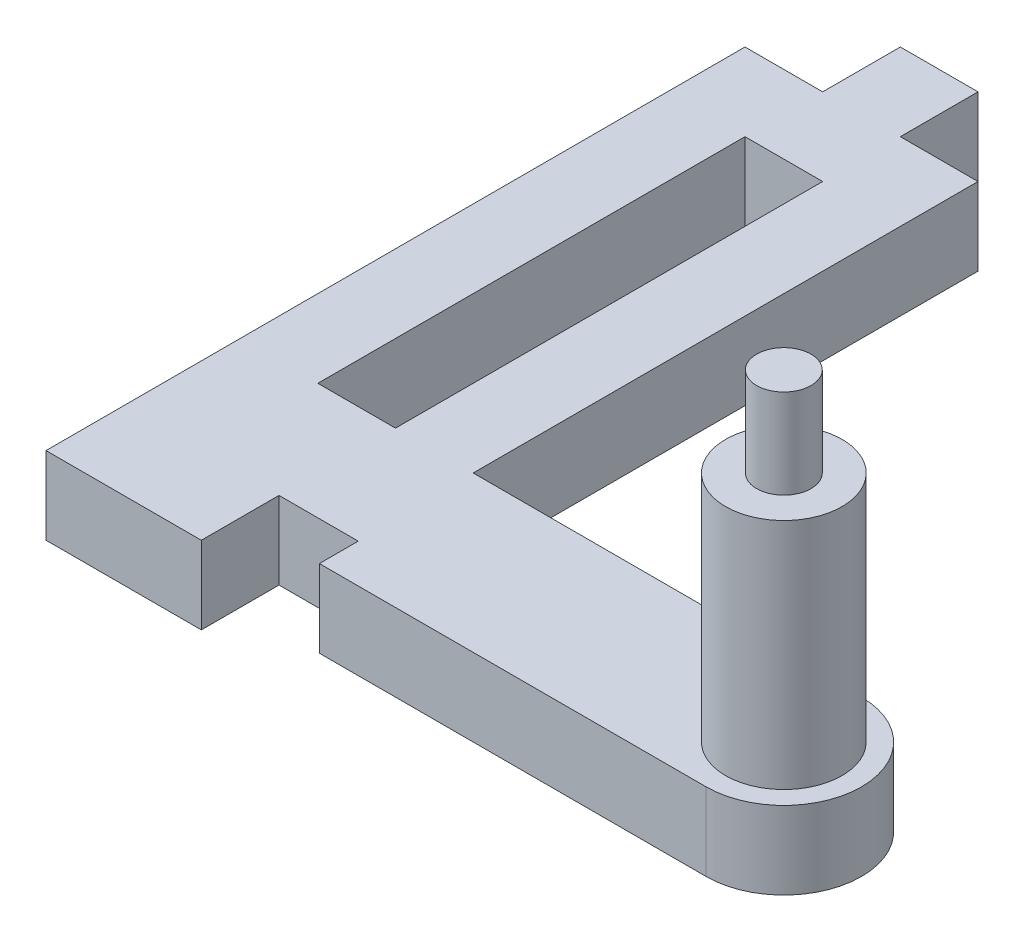
ISO-10303-21;
HEADER;
FILE_DESCRIPTION(('STEP AP214'),'2;1');
FILE_NAME('part.step','',(''),(''),'','','');
FILE_SCHEMA(('AUTOMOTIVE_DESIGN { 1 0 10303 214 1 1 1 1 }'));
ENDSEC;
DATA;
#1=APPLICATION_CONTEXT('core data for automotive mechanical design processes');
#2=APPLICATION_PROTOCOL_DEFINITION('international standard','automotive_design',2000,#1);
#3=PRODUCT_CONTEXT('',#1,'mechanical');
#4=PRODUCT('Part','Part','',(#3));
#5=PRODUCT_RELATED_PRODUCT_CATEGORY('part','',(#4));
#6=PRODUCT_DEFINITION_FORMATION('','',#4);
#7=PRODUCT_DEFINITION_CONTEXT('part definition',#1,'design');
#8=PRODUCT_DEFINITION('design','',#6,#7);
#9=PRODUCT_DEFINITION_SHAPE('','',#8);
#10=(LENGTH_UNIT() NAMED_UNIT(*) SI_UNIT(.MILLI.,.METRE.));
#11=(NAMED_UNIT(*) PLANE_ANGLE_UNIT() SI_UNIT($,.RADIAN.));
#12=(NAMED_UNIT(*) SI_UNIT($,.STERADIAN.) SOLID_ANGLE_UNIT());
#13=UNCERTAINTY_MEASURE_WITH_UNIT(LENGTH_MEASURE(1.E-05),#10,'distance_accuracy_value','');
#14=(GEOMETRIC_REPRESENTATION_CONTEXT(3) GLOBAL_UNCERTAINTY_ASSIGNED_CONTEXT((#13)) GLOBAL_UNIT_ASSIGNED_CONTEXT((#10,
#11,#12)) REPRESENTATION_CONTEXT('',''));
#15=CARTESIAN_POINT('',(0.,0.,0.));
#16=DIRECTION('',(0.,0.,1.));
#17=DIRECTION('',(1.,0.,0.));
#18=AXIS2_PLACEMENT_3D('',#15,#16,#17);
#19=CARTESIAN_POINT('',(0.,5.,0.));
#20=DIRECTION('',(0.,0.,-1.));
#21=DIRECTION('',(-1.,0.,0.));
#22=AXIS2_PLACEMENT_3D('',#19,#20,#21);
#23=PLANE('',#22);
#24=DIRECTION('',(1.,0.,0.));
#25=VECTOR('',#24,1.);
#26=CARTESIAN_POINT('',(0.,0.,0.));
#27=LINE('',#26,#25);
#28=CARTESIAN_POINT('',(10.,0.,0.));
#29=VERTEX_POINT('',#28);
#30=CARTESIAN_POINT('',(15.1,0.,0.));
#31=VERTEX_POINT('',#30);
#32=EDGE_CURVE('E475',#29,#31,#27,.T.);
#33=ORIENTED_EDGE('',*,*,#32,.T.);
#34=DIRECTION('',(0.,-1.,0.));
#35=VECTOR('',#34,1.);
#36=CARTESIAN_POINT('',(15.1,5.,0.));
#37=LINE('',#36,#35);
#38=CARTESIAN_POINT('',(15.1,5.,0.));
#39=VERTEX_POINT('',#38);
#40=EDGE_CURVE('E499',#39,#31,#37,.T.);
#41=ORIENTED_EDGE('',*,*,#40,.F.);
#42=DIRECTION('',(1.,0.,0.));
#43=VECTOR('',#42,1.);
#44=CARTESIAN_POINT('',(0.,5.,0.));
#45=LINE('',#44,#43);
#46=CARTESIAN_POINT('',(10.,5.,0.));
#47=VERTEX_POINT('',#46);
#48=EDGE_CURVE('E449',#47,#39,#45,.T.);
#49=ORIENTED_EDGE('',*,*,#48,.F.);
#50=DIRECTION('',(0.,-1.,0.));
#51=VECTOR('',#50,1.);
#52=CARTESIAN_POINT('',(10.,5.,0.));
#53=LINE('',#52,#51);
#54=EDGE_CURVE('E503',#47,#29,#53,.T.);
#55=ORIENTED_EDGE('',*,*,#54,.T.);
#56=EDGE_LOOP('',(#33,#41,#49,#55));
#57=FACE_BOUND('',#56,.T.);
#58=ADVANCED_FACE('F161',(#57),#23,.F.);
#59=CARTESIAN_POINT('',(0.,5.,-7.5));
#60=DIRECTION('',(0.,0.,-1.));
#61=DIRECTION('',(-1.,0.,0.));
#62=AXIS2_PLACEMENT_3D('',#59,#60,#61);
#63=PLANE('',#62);
#64=DIRECTION('',(1.,0.,0.));
#65=VECTOR('',#64,1.);
#66=CARTESIAN_POINT('',(0.,0.,-7.5));
#67=LINE('',#66,#65);
#68=CARTESIAN_POINT('',(15.,0.,-7.5));
#69=VERTEX_POINT('',#68);
#70=CARTESIAN_POINT('',(40.,0.,-7.5));
#71=VERTEX_POINT('',#70);
#72=EDGE_CURVE('E279',#69,#71,#67,.T.);
#73=ORIENTED_EDGE('',*,*,#72,.F.);
#74=DIRECTION('',(0.,1.,0.));
#75=VECTOR('',#74,1.);
#76=CARTESIAN_POINT('',(15.,5.,-7.5));
#77=LINE('',#76,#75);
#78=CARTESIAN_POINT('',(15.,5.,-7.5));
#79=VERTEX_POINT('',#78);
#80=EDGE_CURVE('E180',#69,#79,#77,.T.);
#81=ORIENTED_EDGE('',*,*,#80,.T.);
#82=DIRECTION('',(1.,0.,0.));
#83=VECTOR('',#82,1.);
#84=CARTESIAN_POINT('',(0.,5.,-7.5));
#85=LINE('',#84,#83);
#86=CARTESIAN_POINT('',(40.,5.,-7.5));
#87=VERTEX_POINT('',#86);
#88=EDGE_CURVE('E443',#79,#87,#85,.T.);
#89=ORIENTED_EDGE('',*,*,#88,.T.);
#90=DIRECTION('',(0.,-1.,0.));
#91=VECTOR('',#90,1.);
#92=CARTESIAN_POINT('',(40.,5.,-7.5));
#93=LINE('',#92,#91);
#94=EDGE_CURVE('E462',#87,#71,#93,.T.);
#95=ORIENTED_EDGE('',*,*,#94,.T.);
#96=EDGE_LOOP('',(#73,#81,#89,#95));
#97=FACE_BOUND('',#96,.T.);
#98=ADVANCED_FACE('F528',(#97),#63,.T.);
#99=CARTESIAN_POINT('',(0.,5.,0.));
#100=DIRECTION('',(-1.,0.,0.));
#101=DIRECTION('',(0.,0.,1.));
#102=AXIS2_PLACEMENT_3D('',#99,#100,#101);
#103=PLANE('',#102);
#104=DIRECTION('',(0.,-1.,0.));
#105=VECTOR('',#104,1.);
#106=CARTESIAN_POINT('',(0.,5.,-40.));
#107=LINE('',#106,#105);
#108=CARTESIAN_POINT('',(0.,5.,-40.));
#109=VERTEX_POINT('',#108);
#110=CARTESIAN_POINT('',(0.,0.,-40.));
#111=VERTEX_POINT('',#110);
#112=EDGE_CURVE('E343',#109,#111,#107,.T.);
#113=ORIENTED_EDGE('',*,*,#112,.T.);
#114=DIRECTION('',(0.,0.,-1.));
#115=VECTOR('',#114,1.);
#116=CARTESIAN_POINT('',(0.,0.,0.));
#117=LINE('',#116,#115);
#118=CARTESIAN_POINT('',(0.,0.,5.));
#119=VERTEX_POINT('',#118);
#120=EDGE_CURVE('E426',#119,#111,#117,.T.);
#121=ORIENTED_EDGE('',*,*,#120,.F.);
#122=DIRECTION('',(0.,-1.,0.));
#123=VECTOR('',#122,1.);
#124=CARTESIAN_POINT('',(0.,5.,5.));
#125=LINE('',#124,#123);
#126=CARTESIAN_POINT('',(0.,5.,5.));
#127=VERTEX_POINT('',#126);
#128=EDGE_CURVE('E297',#127,#119,#125,.T.);
#129=ORIENTED_EDGE('',*,*,#128,.F.);
#130=DIRECTION('',(0.,0.,-1.));
#131=VECTOR('',#130,1.);
#132=CARTESIAN_POINT('',(0.,5.,0.));
#133=LINE('',#132,#131);
#134=EDGE_CURVE('E424',#127,#109,#133,.T.);
#135=ORIENTED_EDGE('',*,*,#134,.T.);
#136=EDGE_LOOP('',(#113,#121,#129,#135));
#137=FACE_BOUND('',#136,.T.);
#138=ADVANCED_FACE('F422',(#137),#103,.T.);
#139=CARTESIAN_POINT('',(15.1,5.,0.));
#140=DIRECTION('',(1.,0.,0.));
#141=DIRECTION('',(0.,0.,-1.));
#142=AXIS2_PLACEMENT_3D('',#139,#140,#141);
#143=PLANE('',#142);
#144=DIRECTION('',(0.,0.,1.));
#145=VECTOR('',#144,1.);
#146=CARTESIAN_POINT('',(15.1,0.,0.));
#147=LINE('',#146,#145);
#148=CARTESIAN_POINT('',(15.1,0.,2.5));
#149=VERTEX_POINT('',#148);
#150=EDGE_CURVE('E478',#31,#149,#147,.T.);
#151=ORIENTED_EDGE('',*,*,#150,.T.);
#152=DIRECTION('',(0.,-1.,0.));
#153=VECTOR('',#152,1.);
#154=CARTESIAN_POINT('',(15.1,5.,2.5));
#155=LINE('',#154,#153);
#156=CARTESIAN_POINT('',(15.1,5.,2.5));
#157=VERTEX_POINT('',#156);
#158=EDGE_CURVE('E495',#157,#149,#155,.T.);
#159=ORIENTED_EDGE('',*,*,#158,.F.);
#160=DIRECTION('',(0.,0.,1.));
#161=VECTOR('',#160,1.);
#162=CARTESIAN_POINT('',(15.1,5.,0.));
#163=LINE('',#162,#161);
#164=EDGE_CURVE('E452',#39,#157,#163,.T.);
#165=ORIENTED_EDGE('',*,*,#164,.F.);
#166=ORIENTED_EDGE('',*,*,#40,.T.);
#167=EDGE_LOOP('',(#151,#159,#165,#166));
#168=FACE_BOUND('',#167,.T.);
#169=ADVANCED_FACE('F517',(#168),#143,.F.);
#170=CARTESIAN_POINT('',(0.,5.,2.5));
#171=DIRECTION('',(0.,0.,-1.));
#172=DIRECTION('',(-1.,0.,0.));
#173=AXIS2_PLACEMENT_3D('',#170,#171,#172);
#174=PLANE('',#173);
#175=DIRECTION('',(1.,0.,0.));
#176=VECTOR('',#175,1.);
#177=CARTESIAN_POINT('',(0.,0.,2.5));
#178=LINE('',#177,#176);
#179=CARTESIAN_POINT('',(40.,0.,2.5));
#180=VERTEX_POINT('',#179);
#181=EDGE_CURVE('E481',#149,#180,#178,.T.);
#182=ORIENTED_EDGE('',*,*,#181,.T.);
#183=DIRECTION('',(0.,-1.,0.));
#184=VECTOR('',#183,1.);
#185=CARTESIAN_POINT('',(40.,5.,2.5));
#186=LINE('',#185,#184);
#187=CARTESIAN_POINT('',(40.,5.,2.5));
#188=VERTEX_POINT('',#187);
#189=EDGE_CURVE('E491',#188,#180,#186,.T.);
#190=ORIENTED_EDGE('',*,*,#189,.F.);
#191=DIRECTION('',(1.,0.,0.));
#192=VECTOR('',#191,1.);
#193=CARTESIAN_POINT('',(0.,5.,2.5));
#194=LINE('',#193,#192);
#195=EDGE_CURVE('E455',#157,#188,#194,.T.);
#196=ORIENTED_EDGE('',*,*,#195,.F.);
#197=ORIENTED_EDGE('',*,*,#158,.T.);
#198=EDGE_LOOP('',(#182,#190,#196,#197));
#199=FACE_BOUND('',#198,.T.);
#200=ADVANCED_FACE('F524',(#199),#174,.F.);
#201=CARTESIAN_POINT('',(40.,5.,-2.5));
#202=DIRECTION('',(0.,-1.,0.));
#203=DIRECTION('',(0.,0.,-1.));
#204=AXIS2_PLACEMENT_3D('',#201,#202,#203);
#205=CYLINDRICAL_SURFACE('',#204,5.);
#206=CARTESIAN_POINT('',(40.,0.,-2.5));
#207=DIRECTION('',(0.,1.,0.));
#208=DIRECTION('',(0.,0.,1.));
#209=AXIS2_PLACEMENT_3D('',#206,#207,#208);
#210=CIRCLE('',#209,5.);
#211=EDGE_CURVE('E484',#180,#71,#210,.T.);
#212=ORIENTED_EDGE('',*,*,#211,.T.);
#213=ORIENTED_EDGE('',*,*,#94,.F.);
#214=CARTESIAN_POINT('',(40.,5.,-2.5));
#215=DIRECTION('',(0.,1.,0.));
#216=DIRECTION('',(0.,0.,1.));
#217=AXIS2_PLACEMENT_3D('',#214,#215,#216);
#218=CIRCLE('',#217,5.);
#219=EDGE_CURVE('E458',#188,#87,#218,.T.);
#220=ORIENTED_EDGE('',*,*,#219,.F.);
#221=ORIENTED_EDGE('',*,*,#189,.T.);
#222=EDGE_LOOP('',(#212,#213,#220,#221));
#223=FACE_BOUND('',#222,.T.);
#224=ADVANCED_FACE('F527',(#223),#205,.T.);
#225=DIRECTION('',(0.,-1.,0.));
#226=VECTOR('',#225,1.);
#227=CARTESIAN_POINT('',(5.,5.,-7.5));
#228=LINE('',#227,#226);
#229=CARTESIAN_POINT('',(5.,5.,-7.5));
#230=VERTEX_POINT('',#229);
#231=CARTESIAN_POINT('',(5.,0.,-7.5));
#232=VERTEX_POINT('',#231);
#233=EDGE_CURVE('E165',#230,#232,#228,.T.);
#234=ORIENTED_EDGE('',*,*,#233,.F.);
#235=CARTESIAN_POINT('',(10.,5.,-7.5));
#236=VERTEX_POINT('',#235);
#237=EDGE_CURVE('E440',#230,#236,#85,.T.);
#238=ORIENTED_EDGE('',*,*,#237,.T.);
#239=DIRECTION('',(0.,-1.,0.));
#240=VECTOR('',#239,1.);
#241=CARTESIAN_POINT('',(10.,5.,-7.5));
#242=LINE('',#241,#240);
#243=CARTESIAN_POINT('',(10.,0.,-7.5));
#244=VERTEX_POINT('',#243);
#245=EDGE_CURVE('E286',#236,#244,#242,.T.);
#246=ORIENTED_EDGE('',*,*,#245,.T.);
#247=EDGE_CURVE('E465',#232,#244,#67,.T.);
#248=ORIENTED_EDGE('',*,*,#247,.F.);
#249=EDGE_LOOP('',(#234,#238,#246,#248));
#250=FACE_BOUND('',#249,.T.);
#251=ADVANCED_FACE('F535',(#250),#63,.T.);
#252=CARTESIAN_POINT('',(0.,5.,0.));
#253=DIRECTION('',(0.,1.,0.));
#254=DIRECTION('',(0.,0.,1.));
#255=AXIS2_PLACEMENT_3D('',#252,#253,#254);
#256=PLANE('',#255);
#257=CARTESIAN_POINT('',(40.,5.,-2.5));
#258=DIRECTION('',(0.,1.,0.));
#259=DIRECTION('',(0.,0.,1.));
#260=AXIS2_PLACEMENT_3D('',#257,#258,#259);
#261=CIRCLE('',#260,3.75);
#262=CARTESIAN_POINT('',(40.,5.,1.25));
#263=VERTEX_POINT('',#262);
#264=EDGE_CURVE('E272',#263,#263,#261,.T.);
#265=ORIENTED_EDGE('',*,*,#264,.F.);
#266=EDGE_LOOP('',(#265));
#267=FACE_BOUND('',#266,.T.);
#268=ORIENTED_EDGE('',*,*,#88,.F.);
#269=DIRECTION('',(0.,0.,-1.));
#270=VECTOR('',#269,1.);
#271=CARTESIAN_POINT('',(15.,5.,-7.5));
#272=LINE('',#271,#270);
#273=CARTESIAN_POINT('',(15.,5.,-40.));
#274=VERTEX_POINT('',#273);
#275=EDGE_CURVE('E338',#79,#274,#272,.T.);
#276=ORIENTED_EDGE('',*,*,#275,.T.);
#277=DIRECTION('',(1.,0.,0.));
#278=VECTOR('',#277,1.);
#279=CARTESIAN_POINT('',(0.,5.,-40.));
#280=LINE('',#279,#278);
#281=CARTESIAN_POINT('',(9.99999999999999,5.,-40.));
#282=VERTEX_POINT('',#281);
#283=EDGE_CURVE('E339',#282,#274,#280,.T.);
#284=ORIENTED_EDGE('',*,*,#283,.F.);
#285=DIRECTION('',(0.,0.,-1.));
#286=VECTOR('',#285,1.);
#287=CARTESIAN_POINT('',(9.99999999999999,5.,-40.));
#288=LINE('',#287,#286);
#289=CARTESIAN_POINT('',(10.,5.,-45.));
#290=VERTEX_POINT('',#289);
#291=EDGE_CURVE('E259',#282,#290,#288,.T.);
#292=ORIENTED_EDGE('',*,*,#291,.T.);
#293=DIRECTION('',(-1.,0.,0.));
#294=VECTOR('',#293,1.);
#295=CARTESIAN_POINT('',(10.,5.,-45.));
#296=LINE('',#295,#294);
#297=CARTESIAN_POINT('',(5.,5.,-45.));
#298=VERTEX_POINT('',#297);
#299=EDGE_CURVE('E252',#290,#298,#296,.T.);
#300=ORIENTED_EDGE('',*,*,#299,.T.);
#301=DIRECTION('',(0.,0.,-1.));
#302=VECTOR('',#301,1.);
#303=CARTESIAN_POINT('',(5.,5.,-40.));
#304=LINE('',#303,#302);
#305=CARTESIAN_POINT('',(5.,5.,-40.));
#306=VERTEX_POINT('',#305);
#307=EDGE_CURVE('E358',#306,#298,#304,.T.);
#308=ORIENTED_EDGE('',*,*,#307,.F.);
#309=EDGE_CURVE('E334',#109,#306,#280,.T.);
#310=ORIENTED_EDGE('',*,*,#309,.F.);
#311=ORIENTED_EDGE('',*,*,#134,.F.);
#312=DIRECTION('',(1.,0.,0.));
#313=VECTOR('',#312,1.);
#314=CARTESIAN_POINT('',(0.,5.,5.));
#315=LINE('',#314,#313);
#316=CARTESIAN_POINT('',(10.,5.,5.));
#317=VERTEX_POINT('',#316);
#318=EDGE_CURVE('E431',#127,#317,#315,.T.);
#319=ORIENTED_EDGE('',*,*,#318,.T.);
#320=DIRECTION('',(0.,0.,1.));
#321=VECTOR('',#320,1.);
#322=CARTESIAN_POINT('',(10.,5.,0.));
#323=LINE('',#322,#321);
#324=EDGE_CURVE('E436',#47,#317,#323,.T.);
#325=ORIENTED_EDGE('',*,*,#324,.F.);
#326=ORIENTED_EDGE('',*,*,#48,.T.);
#327=ORIENTED_EDGE('',*,*,#164,.T.);
#328=ORIENTED_EDGE('',*,*,#195,.T.);
#329=ORIENTED_EDGE('',*,*,#219,.T.);
#330=EDGE_LOOP('',(#268,#276,#284,#292,#300,#308,#310,#311,#319,#325,#326,#327,#328,#329));
#331=FACE_BOUND('',#330,.T.);
#332=ORIENTED_EDGE('',*,*,#237,.F.);
#333=DIRECTION('',(0.,0.,1.));
#334=VECTOR('',#333,1.);
#335=CARTESIAN_POINT('',(5.,5.,-35.));
#336=LINE('',#335,#334);
#337=CARTESIAN_POINT('',(5.,5.,-35.));
#338=VERTEX_POINT('',#337);
#339=EDGE_CURVE('E314',#338,#230,#336,.T.);
#340=ORIENTED_EDGE('',*,*,#339,.F.);
#341=DIRECTION('',(1.,0.,0.));
#342=VECTOR('',#341,1.);
#343=CARTESIAN_POINT('',(5.,5.,-35.));
#344=LINE('',#343,#342);
#345=CARTESIAN_POINT('',(10.,5.,-35.));
#346=VERTEX_POINT('',#345);
#347=EDGE_CURVE('E309',#338,#346,#344,.T.);
#348=ORIENTED_EDGE('',*,*,#347,.T.);
#349=DIRECTION('',(0.,0.,1.));
#350=VECTOR('',#349,1.);
#351=CARTESIAN_POINT('',(10.,5.,-35.));
#352=LINE('',#351,#350);
#353=EDGE_CURVE('E305',#346,#236,#352,.T.);
#354=ORIENTED_EDGE('',*,*,#353,.T.);
#355=EDGE_LOOP('',(#332,#340,#348,#354));
#356=FACE_BOUND('',#355,.T.);
#357=ADVANCED_FACE('F365',(#267,#331,#356),#256,.T.);
#358=CARTESIAN_POINT('',(0.,5.,5.));
#359=DIRECTION('',(0.,0.,-1.));
#360=DIRECTION('',(-1.,0.,0.));
#361=AXIS2_PLACEMENT_3D('',#358,#359,#360);
#362=PLANE('',#361);
#363=DIRECTION('',(1.,0.,0.));
#364=VECTOR('',#363,1.);
#365=CARTESIAN_POINT('',(0.,0.,5.));
#366=LINE('',#365,#364);
#367=CARTESIAN_POINT('',(10.,0.,5.));
#368=VERTEX_POINT('',#367);
#369=EDGE_CURVE('E468',#119,#368,#366,.T.);
#370=ORIENTED_EDGE('',*,*,#369,.T.);
#371=DIRECTION('',(0.,-1.,0.));
#372=VECTOR('',#371,1.);
#373=CARTESIAN_POINT('',(10.,5.,5.));
#374=LINE('',#373,#372);
#375=EDGE_CURVE('E301',#317,#368,#374,.T.);
#376=ORIENTED_EDGE('',*,*,#375,.F.);
#377=ORIENTED_EDGE('',*,*,#318,.F.);
#378=ORIENTED_EDGE('',*,*,#128,.T.);
#379=EDGE_LOOP('',(#370,#376,#377,#378));
#380=FACE_BOUND('',#379,.T.);
#381=ADVANCED_FACE('F432',(#380),#362,.F.);
#382=CARTESIAN_POINT('',(10.,5.,0.));
#383=DIRECTION('',(1.,0.,0.));
#384=DIRECTION('',(0.,0.,-1.));
#385=AXIS2_PLACEMENT_3D('',#382,#383,#384);
#386=PLANE('',#385);
#387=DIRECTION('',(0.,0.,1.));
#388=VECTOR('',#387,1.);
#389=CARTESIAN_POINT('',(10.,0.,0.));
#390=LINE('',#389,#388);
#391=EDGE_CURVE('E471',#29,#368,#390,.T.);
#392=ORIENTED_EDGE('',*,*,#391,.F.);
#393=ORIENTED_EDGE('',*,*,#54,.F.);
#394=ORIENTED_EDGE('',*,*,#324,.T.);
#395=ORIENTED_EDGE('',*,*,#375,.T.);
#396=EDGE_LOOP('',(#392,#393,#394,#395));
#397=FACE_BOUND('',#396,.T.);
#398=ADVANCED_FACE('F508',(#397),#386,.T.);
#399=CARTESIAN_POINT('',(0.,0.,0.));
#400=DIRECTION('',(0.,1.,0.));
#401=DIRECTION('',(0.,0.,1.));
#402=AXIS2_PLACEMENT_3D('',#399,#400,#401);
#403=PLANE('',#402);
#404=DIRECTION('',(0.,0.,-1.));
#405=VECTOR('',#404,1.);
#406=CARTESIAN_POINT('',(15.,0.,-7.5));
#407=LINE('',#406,#405);
#408=CARTESIAN_POINT('',(15.,0.,-40.));
#409=VERTEX_POINT('',#408);
#410=EDGE_CURVE('E347',#69,#409,#407,.T.);
#411=ORIENTED_EDGE('',*,*,#410,.F.);
#412=ORIENTED_EDGE('',*,*,#72,.T.);
#413=ORIENTED_EDGE('',*,*,#211,.F.);
#414=ORIENTED_EDGE('',*,*,#181,.F.);
#415=ORIENTED_EDGE('',*,*,#150,.F.);
#416=ORIENTED_EDGE('',*,*,#32,.F.);
#417=ORIENTED_EDGE('',*,*,#391,.T.);
#418=ORIENTED_EDGE('',*,*,#369,.F.);
#419=ORIENTED_EDGE('',*,*,#120,.T.);
#420=DIRECTION('',(1.,0.,0.));
#421=VECTOR('',#420,1.);
#422=CARTESIAN_POINT('',(0.,0.,-40.));
#423=LINE('',#422,#421);
#424=CARTESIAN_POINT('',(5.,0.,-40.));
#425=VERTEX_POINT('',#424);
#426=EDGE_CURVE('E344',#111,#425,#423,.T.);
#427=ORIENTED_EDGE('',*,*,#426,.T.);
#428=DIRECTION('',(0.,0.,-1.));
#429=VECTOR('',#428,1.);
#430=CARTESIAN_POINT('',(5.,0.,-40.));
#431=LINE('',#430,#429);
#432=CARTESIAN_POINT('',(5.,0.,-45.));
#433=VERTEX_POINT('',#432);
#434=EDGE_CURVE('E253',#425,#433,#431,.T.);
#435=ORIENTED_EDGE('',*,*,#434,.T.);
#436=DIRECTION('',(-1.,0.,0.));
#437=VECTOR('',#436,1.);
#438=CARTESIAN_POINT('',(10.,0.,-45.));
#439=LINE('',#438,#437);
#440=CARTESIAN_POINT('',(10.,0.,-45.));
#441=VERTEX_POINT('',#440);
#442=EDGE_CURVE('E256',#441,#433,#439,.T.);
#443=ORIENTED_EDGE('',*,*,#442,.F.);
#444=DIRECTION('',(0.,0.,-1.));
#445=VECTOR('',#444,1.);
#446=CARTESIAN_POINT('',(9.99999999999999,0.,-40.));
#447=LINE('',#446,#445);
#448=CARTESIAN_POINT('',(9.99999999999999,0.,-40.));
#449=VERTEX_POINT('',#448);
#450=EDGE_CURVE('E241',#449,#441,#447,.T.);
#451=ORIENTED_EDGE('',*,*,#450,.F.);
#452=EDGE_CURVE('E333',#449,#409,#423,.T.);
#453=ORIENTED_EDGE('',*,*,#452,.T.);
#454=EDGE_LOOP('',(#411,#412,#413,#414,#415,#416,#417,#418,#419,#427,#435,#443,#451,#453));
#455=FACE_BOUND('',#454,.T.);
#456=ORIENTED_EDGE('',*,*,#247,.T.);
#457=DIRECTION('',(0.,0.,1.));
#458=VECTOR('',#457,1.);
#459=CARTESIAN_POINT('',(10.,0.,-35.));
#460=LINE('',#459,#458);
#461=CARTESIAN_POINT('',(10.,0.,-35.));
#462=VERTEX_POINT('',#461);
#463=EDGE_CURVE('E285',#462,#244,#460,.T.);
#464=ORIENTED_EDGE('',*,*,#463,.F.);
#465=DIRECTION('',(1.,0.,0.));
#466=VECTOR('',#465,1.);
#467=CARTESIAN_POINT('',(5.,0.,-35.));
#468=LINE('',#467,#466);
#469=CARTESIAN_POINT('',(5.,0.,-35.));
#470=VERTEX_POINT('',#469);
#471=EDGE_CURVE('E321',#470,#462,#468,.T.);
#472=ORIENTED_EDGE('',*,*,#471,.F.);
#473=DIRECTION('',(0.,0.,1.));
#474=VECTOR('',#473,1.);
#475=CARTESIAN_POINT('',(5.,0.,-35.));
#476=LINE('',#475,#474);
#477=EDGE_CURVE('E310',#470,#232,#476,.T.);
#478=ORIENTED_EDGE('',*,*,#477,.T.);
#479=EDGE_LOOP('',(#456,#464,#472,#478));
#480=FACE_BOUND('',#479,.T.);
#481=ADVANCED_FACE('F262',(#455,#480),#403,.F.);
#482=CARTESIAN_POINT('',(9.99999999999999,5.,-40.));
#483=DIRECTION('',(-1.,0.,0.));
#484=DIRECTION('',(0.,0.,1.));
#485=AXIS2_PLACEMENT_3D('',#482,#483,#484);
#486=PLANE('',#485);
#487=ORIENTED_EDGE('',*,*,#450,.T.);
#488=DIRECTION('',(0.,-1.,0.));
#489=VECTOR('',#488,1.);
#490=CARTESIAN_POINT('',(10.,5.,-45.));
#491=LINE('',#490,#489);
#492=EDGE_CURVE('E245',#290,#441,#491,.T.);
#493=ORIENTED_EDGE('',*,*,#492,.F.);
#494=ORIENTED_EDGE('',*,*,#291,.F.);
#495=DIRECTION('',(0.,-1.,0.));
#496=VECTOR('',#495,1.);
#497=CARTESIAN_POINT('',(9.99999999999999,5.,-40.));
#498=LINE('',#497,#496);
#499=EDGE_CURVE('E247',#282,#449,#498,.T.);
#500=ORIENTED_EDGE('',*,*,#499,.T.);
#501=EDGE_LOOP('',(#487,#493,#494,#500));
#502=FACE_BOUND('',#501,.T.);
#503=ADVANCED_FACE('F243',(#502),#486,.F.);
#504=CARTESIAN_POINT('',(10.,5.,-45.));
#505=DIRECTION('',(0.,0.,1.));
#506=DIRECTION('',(1.,0.,0.));
#507=AXIS2_PLACEMENT_3D('',#504,#505,#506);
#508=PLANE('',#507);
#509=ORIENTED_EDGE('',*,*,#442,.T.);
#510=DIRECTION('',(0.,-1.,0.));
#511=VECTOR('',#510,1.);
#512=CARTESIAN_POINT('',(5.,5.,-45.));
#513=LINE('',#512,#511);
#514=EDGE_CURVE('E235',#298,#433,#513,.T.);
#515=ORIENTED_EDGE('',*,*,#514,.F.);
#516=ORIENTED_EDGE('',*,*,#299,.F.);
#517=ORIENTED_EDGE('',*,*,#492,.T.);
#518=EDGE_LOOP('',(#509,#515,#516,#517));
#519=FACE_BOUND('',#518,.T.);
#520=ADVANCED_FACE('F163',(#519),#508,.F.);
#521=CARTESIAN_POINT('',(5.,5.,-40.));
#522=DIRECTION('',(-1.,0.,0.));
#523=DIRECTION('',(0.,0.,1.));
#524=AXIS2_PLACEMENT_3D('',#521,#522,#523);
#525=PLANE('',#524);
#526=ORIENTED_EDGE('',*,*,#434,.F.);
#527=DIRECTION('',(0.,-1.,0.));
#528=VECTOR('',#527,1.);
#529=CARTESIAN_POINT('',(5.,5.,-40.));
#530=LINE('',#529,#528);
#531=EDGE_CURVE('E280',#306,#425,#530,.T.);
#532=ORIENTED_EDGE('',*,*,#531,.F.);
#533=ORIENTED_EDGE('',*,*,#307,.T.);
#534=ORIENTED_EDGE('',*,*,#514,.T.);
#535=EDGE_LOOP('',(#526,#532,#533,#534));
#536=FACE_BOUND('',#535,.T.);
#537=ADVANCED_FACE('F553',(#536),#525,.T.);
#538=CARTESIAN_POINT('',(5.,5.,-35.));
#539=DIRECTION('',(1.,0.,0.));
#540=DIRECTION('',(0.,0.,-1.));
#541=AXIS2_PLACEMENT_3D('',#538,#539,#540);
#542=PLANE('',#541);
#543=ORIENTED_EDGE('',*,*,#339,.T.);
#544=ORIENTED_EDGE('',*,*,#233,.T.);
#545=ORIENTED_EDGE('',*,*,#477,.F.);
#546=DIRECTION('',(0.,-1.,0.));
#547=VECTOR('',#546,1.);
#548=CARTESIAN_POINT('',(5.,5.,-35.));
#549=LINE('',#548,#547);
#550=EDGE_CURVE('E318',#338,#470,#549,.T.);
#551=ORIENTED_EDGE('',*,*,#550,.F.);
#552=EDGE_LOOP('',(#543,#544,#545,#551));
#553=FACE_BOUND('',#552,.T.);
#554=ADVANCED_FACE('F540',(#553),#542,.T.);
#555=CARTESIAN_POINT('',(5.,5.,-35.));
#556=DIRECTION('',(0.,0.,-1.));
#557=DIRECTION('',(-1.,0.,0.));
#558=AXIS2_PLACEMENT_3D('',#555,#556,#557);
#559=PLANE('',#558);
#560=ORIENTED_EDGE('',*,*,#471,.T.);
#561=DIRECTION('',(0.,-1.,0.));
#562=VECTOR('',#561,1.);
#563=CARTESIAN_POINT('',(10.,5.,-35.));
#564=LINE('',#563,#562);
#565=EDGE_CURVE('E330',#346,#462,#564,.T.);
#566=ORIENTED_EDGE('',*,*,#565,.F.);
#567=ORIENTED_EDGE('',*,*,#347,.F.);
#568=ORIENTED_EDGE('',*,*,#550,.T.);
#569=EDGE_LOOP('',(#560,#566,#567,#568));
#570=FACE_BOUND('',#569,.T.);
#571=ADVANCED_FACE('F545',(#570),#559,.F.);
#572=CARTESIAN_POINT('',(10.,5.,-35.));
#573=DIRECTION('',(1.,0.,0.));
#574=DIRECTION('',(0.,0.,-1.));
#575=AXIS2_PLACEMENT_3D('',#572,#573,#574);
#576=PLANE('',#575);
#577=ORIENTED_EDGE('',*,*,#245,.F.);
#578=ORIENTED_EDGE('',*,*,#353,.F.);
#579=ORIENTED_EDGE('',*,*,#565,.T.);
#580=ORIENTED_EDGE('',*,*,#463,.T.);
#581=EDGE_LOOP('',(#577,#578,#579,#580));
#582=FACE_BOUND('',#581,.T.);
#583=ADVANCED_FACE('F543',(#582),#576,.F.);
#584=CARTESIAN_POINT('',(15.,5.,-7.5));
#585=DIRECTION('',(-1.,0.,0.));
#586=DIRECTION('',(0.,0.,1.));
#587=AXIS2_PLACEMENT_3D('',#584,#585,#586);
#588=PLANE('',#587);
#589=ORIENTED_EDGE('',*,*,#410,.T.);
#590=DIRECTION('',(0.,-1.,0.));
#591=VECTOR('',#590,1.);
#592=CARTESIAN_POINT('',(15.,5.,-40.));
#593=LINE('',#592,#591);
#594=EDGE_CURVE('E283',#274,#409,#593,.T.);
#595=ORIENTED_EDGE('',*,*,#594,.F.);
#596=ORIENTED_EDGE('',*,*,#275,.F.);
#597=ORIENTED_EDGE('',*,*,#80,.F.);
#598=EDGE_LOOP('',(#589,#595,#596,#597));
#599=FACE_BOUND('',#598,.T.);
#600=ADVANCED_FACE('F375',(#599),#588,.F.);
#601=CARTESIAN_POINT('',(0.,5.,-40.));
#602=DIRECTION('',(0.,0.,-1.));
#603=DIRECTION('',(-1.,0.,0.));
#604=AXIS2_PLACEMENT_3D('',#601,#602,#603);
#605=PLANE('',#604);
#606=ORIENTED_EDGE('',*,*,#499,.F.);
#607=ORIENTED_EDGE('',*,*,#283,.T.);
#608=ORIENTED_EDGE('',*,*,#594,.T.);
#609=ORIENTED_EDGE('',*,*,#452,.F.);
#610=EDGE_LOOP('',(#606,#607,#608,#609));
#611=FACE_BOUND('',#610,.T.);
#612=ADVANCED_FACE('F373',(#611),#605,.T.);
#613=ORIENTED_EDGE('',*,*,#309,.T.);
#614=ORIENTED_EDGE('',*,*,#531,.T.);
#615=ORIENTED_EDGE('',*,*,#426,.F.);
#616=ORIENTED_EDGE('',*,*,#112,.F.);
#617=EDGE_LOOP('',(#613,#614,#615,#616));
#618=FACE_BOUND('',#617,.T.);
#619=ADVANCED_FACE('F653',(#618),#605,.T.);
#620=CARTESIAN_POINT('',(40.,20.,-2.5));
#621=DIRECTION('',(0.,-1.,0.));
#622=DIRECTION('',(0.,0.,-1.));
#623=AXIS2_PLACEMENT_3D('',#620,#621,#622);
#624=CYLINDRICAL_SURFACE('',#623,3.75);
#625=CARTESIAN_POINT('',(40.,20.,-2.5));
#626=DIRECTION('',(0.,1.,0.));
#627=DIRECTION('',(0.,0.,1.));
#628=AXIS2_PLACEMENT_3D('',#625,#626,#627);
#629=CIRCLE('',#628,3.75);
#630=CARTESIAN_POINT('',(40.,20.,1.25));
#631=VERTEX_POINT('',#630);
#632=EDGE_CURVE('E266',#631,#631,#629,.T.);
#633=ORIENTED_EDGE('',*,*,#632,.F.);
#634=EDGE_LOOP('',(#633));
#635=FACE_BOUND('',#634,.T.);
#636=ORIENTED_EDGE('',*,*,#264,.T.);
#637=EDGE_LOOP('',(#636));
#638=FACE_BOUND('',#637,.T.);
#639=ADVANCED_FACE('F661',(#635,#638),#624,.T.);
#640=CARTESIAN_POINT('',(40.,20.,-2.5));
#641=DIRECTION('',(0.,1.,0.));
#642=DIRECTION('',(0.,0.,1.));
#643=AXIS2_PLACEMENT_3D('',#640,#641,#642);
#644=PLANE('',#643);
#645=CARTESIAN_POINT('',(40.,20.,-2.5));
#646=DIRECTION('',(0.,1.,0.));
#647=DIRECTION('',(0.,0.,1.));
#648=AXIS2_PLACEMENT_3D('',#645,#646,#647);
#649=CIRCLE('',#648,1.75);
#650=CARTESIAN_POINT('',(40.,20.,-0.749999999999997));
#651=VERTEX_POINT('',#650);
#652=EDGE_CURVE('E12',#651,#651,#649,.T.);
#653=ORIENTED_EDGE('',*,*,#652,.F.);
#654=EDGE_LOOP('',(#653));
#655=FACE_BOUND('',#654,.T.);
#656=ORIENTED_EDGE('',*,*,#632,.T.);
#657=EDGE_LOOP('',(#656));
#658=FACE_BOUND('',#657,.T.);
#659=ADVANCED_FACE('F676',(#655,#658),#644,.T.);
#660=CARTESIAN_POINT('',(40.,25.75,-2.5));
#661=DIRECTION('',(0.,-1.,0.));
#662=DIRECTION('',(0.,0.,-1.));
#663=AXIS2_PLACEMENT_3D('',#660,#661,#662);
#664=CYLINDRICAL_SURFACE('',#663,1.75);
#665=CARTESIAN_POINT('',(40.,25.75,-2.5));
#666=DIRECTION('',(0.,1.,0.));
#667=DIRECTION('',(0.,0.,1.));
#668=AXIS2_PLACEMENT_3D('',#665,#666,#667);
#669=CIRCLE('',#668,1.75);
#670=CARTESIAN_POINT('',(40.,25.75,-0.749999999999997));
#671=VERTEX_POINT('',#670);
#672=EDGE_CURVE('E711',#671,#671,#669,.T.);
#673=ORIENTED_EDGE('',*,*,#672,.F.);
#674=EDGE_LOOP('',(#673));
#675=FACE_BOUND('',#674,.T.);
#676=ORIENTED_EDGE('',*,*,#652,.T.);
#677=EDGE_LOOP('',(#676));
#678=FACE_BOUND('',#677,.T.);
#679=ADVANCED_FACE('F685',(#675,#678),#664,.T.);
#680=CARTESIAN_POINT('',(40.,25.75,-2.5));
#681=DIRECTION('',(0.,1.,0.));
#682=DIRECTION('',(0.,0.,1.));
#683=AXIS2_PLACEMENT_3D('',#680,#681,#682);
#684=PLANE('',#683);
#685=ORIENTED_EDGE('',*,*,#672,.T.);
#686=EDGE_LOOP('',(#685));
#687=FACE_BOUND('',#686,.T.);
#688=ADVANCED_FACE('F695',(#687),#684,.T.);
#689=CLOSED_SHELL('',(#58,#98,#138,#169,#200,#224,#251,#357,#381,#398,#481,#503,#520,#537,#554,
#571,#583,#600,#612,#619,#639,#659,#679,#688));
#690=MANIFOLD_SOLID_BREP('B2',#689);
#691=ADVANCED_BREP_SHAPE_REPRESENTATION('',(#18,#690),#14);
#692=SHAPE_DEFINITION_REPRESENTATION(#9,#691);
ENDSEC;
END-ISO-10303-21;
